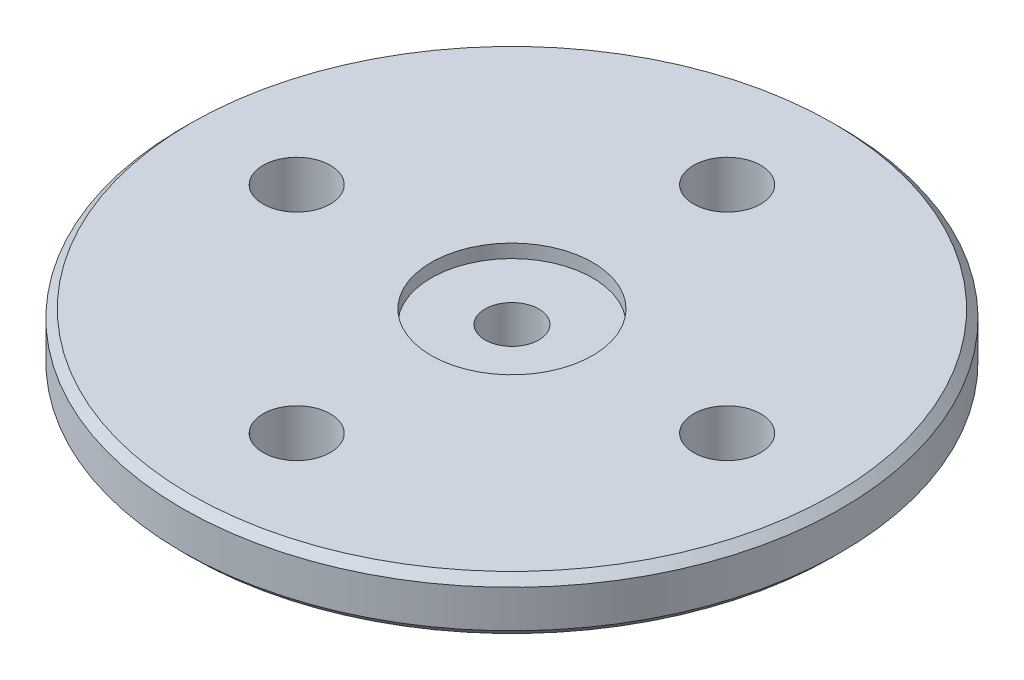
ISO-10303-21;
HEADER;
FILE_DESCRIPTION(('STEP AP214'),'2;1');
FILE_NAME('part.step','',(''),(''),'','','');
FILE_SCHEMA(('AUTOMOTIVE_DESIGN { 1 0 10303 214 1 1 1 1 }'));
ENDSEC;
DATA;
#1=APPLICATION_CONTEXT('core data for automotive mechanical design processes');
#2=APPLICATION_PROTOCOL_DEFINITION('international standard','automotive_design',2000,#1);
#3=PRODUCT_CONTEXT('',#1,'mechanical');
#4=PRODUCT('Part','Part','',(#3));
#5=PRODUCT_RELATED_PRODUCT_CATEGORY('part','',(#4));
#6=PRODUCT_DEFINITION_FORMATION('','',#4);
#7=PRODUCT_DEFINITION_CONTEXT('part definition',#1,'design');
#8=PRODUCT_DEFINITION('design','',#6,#7);
#9=PRODUCT_DEFINITION_SHAPE('','',#8);
#10=(LENGTH_UNIT() NAMED_UNIT(*) SI_UNIT(.MILLI.,.METRE.));
#11=(NAMED_UNIT(*) PLANE_ANGLE_UNIT() SI_UNIT($,.RADIAN.));
#12=(NAMED_UNIT(*) SI_UNIT($,.STERADIAN.) SOLID_ANGLE_UNIT());
#13=UNCERTAINTY_MEASURE_WITH_UNIT(LENGTH_MEASURE(1.E-05),#10,'distance_accuracy_value','');
#14=(GEOMETRIC_REPRESENTATION_CONTEXT(3) GLOBAL_UNCERTAINTY_ASSIGNED_CONTEXT((#13)) GLOBAL_UNIT_ASSIGNED_CONTEXT((#10,
#11,#12)) REPRESENTATION_CONTEXT('',''));
#15=CARTESIAN_POINT('',(0.,0.,0.));
#16=DIRECTION('',(0.,0.,1.));
#17=DIRECTION('',(1.,0.,0.));
#18=AXIS2_PLACEMENT_3D('',#15,#16,#17);
#19=CARTESIAN_POINT('',(0.,5.,0.));
#20=DIRECTION('',(0.,-1.,0.));
#21=DIRECTION('',(0.,0.,-1.));
#22=AXIS2_PLACEMENT_3D('',#19,#20,#21);
#23=CYLINDRICAL_SURFACE('',#22,1.);
#24=CARTESIAN_POINT('',(0.,4.5,0.));
#25=DIRECTION('',(0.,1.,0.));
#26=DIRECTION('',(0.,0.,1.));
#27=AXIS2_PLACEMENT_3D('',#24,#25,#26);
#28=CIRCLE('',#27,1.);
#29=CARTESIAN_POINT('',(0.,4.5,1.));
#30=VERTEX_POINT('',#29);
#31=EDGE_CURVE('E53',#30,#30,#28,.T.);
#32=ORIENTED_EDGE('',*,*,#31,.T.);
#33=EDGE_LOOP('',(#32));
#34=FACE_BOUND('',#33,.T.);
#35=CARTESIAN_POINT('',(0.,3.,0.));
#36=DIRECTION('',(0.,-1.,0.));
#37=DIRECTION('',(0.,0.,-1.));
#38=AXIS2_PLACEMENT_3D('',#35,#36,#37);
#39=CIRCLE('',#38,1.);
#40=CARTESIAN_POINT('',(0.,3.,-1.));
#41=VERTEX_POINT('',#40);
#42=EDGE_CURVE('E41',#41,#41,#39,.T.);
#43=ORIENTED_EDGE('',*,*,#42,.T.);
#44=EDGE_LOOP('',(#43));
#45=FACE_BOUND('',#44,.T.);
#46=ADVANCED_FACE('F37',(#34,#45),#23,.F.);
#47=CARTESIAN_POINT('',(0.,5.,0.));
#48=DIRECTION('',(0.,-1.,0.));
#49=DIRECTION('',(0.,0.,-1.));
#50=AXIS2_PLACEMENT_3D('',#47,#48,#49);
#51=CYLINDRICAL_SURFACE('',#50,4.);
#52=CARTESIAN_POINT('',(0.,0.300000000000002,0.));
#53=DIRECTION('',(0.,1.,0.));
#54=DIRECTION('',(0.,0.,1.));
#55=AXIS2_PLACEMENT_3D('',#52,#53,#54);
#56=CIRCLE('',#55,4.);
#57=CARTESIAN_POINT('',(0.,0.300000000000002,4.));
#58=VERTEX_POINT('',#57);
#59=EDGE_CURVE('E96',#58,#58,#56,.T.);
#60=ORIENTED_EDGE('',*,*,#59,.T.);
#61=EDGE_LOOP('',(#60));
#62=FACE_BOUND('',#61,.T.);
#63=CARTESIAN_POINT('',(0.,2.7,0.));
#64=DIRECTION('',(0.,1.,0.));
#65=DIRECTION('',(0.,0.,1.));
#66=AXIS2_PLACEMENT_3D('',#63,#64,#65);
#67=CIRCLE('',#66,4.);
#68=CARTESIAN_POINT('',(0.,2.7,4.));
#69=VERTEX_POINT('',#68);
#70=EDGE_CURVE('E91',#69,#69,#67,.F.);
#71=ORIENTED_EDGE('',*,*,#70,.T.);
#72=EDGE_LOOP('',(#71));
#73=FACE_BOUND('',#72,.T.);
#74=ADVANCED_FACE('F127',(#62,#73),#51,.T.);
#75=CARTESIAN_POINT('',(0.,5.,0.));
#76=DIRECTION('',(0.,1.,0.));
#77=DIRECTION('',(0.,0.,1.));
#78=AXIS2_PLACEMENT_3D('',#75,#76,#77);
#79=PLANE('',#78);
#80=CARTESIAN_POINT('',(0.,5.,0.));
#81=DIRECTION('',(0.,1.,0.));
#82=DIRECTION('',(0.,0.,1.));
#83=AXIS2_PLACEMENT_3D('',#80,#81,#82);
#84=CIRCLE('',#83,3.);
#85=CARTESIAN_POINT('',(0.,5.,3.));
#86=VERTEX_POINT('',#85);
#87=EDGE_CURVE('E63',#86,#86,#84,.T.);
#88=ORIENTED_EDGE('',*,*,#87,.F.);
#89=EDGE_LOOP('',(#88));
#90=FACE_BOUND('',#89,.T.);
#91=CARTESIAN_POINT('',(0.,5.,0.));
#92=DIRECTION('',(0.,1.,0.));
#93=DIRECTION('',(0.,0.,1.));
#94=AXIS2_PLACEMENT_3D('',#91,#92,#93);
#95=CIRCLE('',#94,11.95);
#96=CARTESIAN_POINT('',(0.,5.,11.95));
#97=VERTEX_POINT('',#96);
#98=EDGE_CURVE('E10',#97,#97,#95,.T.);
#99=ORIENTED_EDGE('',*,*,#98,.T.);
#100=EDGE_LOOP('',(#99));
#101=FACE_BOUND('',#100,.T.);
#102=CARTESIAN_POINT('',(-8.,5.,0.));
#103=DIRECTION('',(0.,1.,0.));
#104=DIRECTION('',(0.,0.,1.));
#105=AXIS2_PLACEMENT_3D('',#102,#103,#104);
#106=CIRCLE('',#105,1.25);
#107=CARTESIAN_POINT('',(-8.,5.,1.25));
#108=VERTEX_POINT('',#107);
#109=EDGE_CURVE('E55',#108,#108,#106,.T.);
#110=ORIENTED_EDGE('',*,*,#109,.F.);
#111=EDGE_LOOP('',(#110));
#112=FACE_BOUND('',#111,.T.);
#113=CARTESIAN_POINT('',(0.,5.,8.));
#114=DIRECTION('',(0.,1.,0.));
#115=DIRECTION('',(0.,0.,1.));
#116=AXIS2_PLACEMENT_3D('',#113,#114,#115);
#117=CIRCLE('',#116,1.25);
#118=CARTESIAN_POINT('',(0.,5.,9.25));
#119=VERTEX_POINT('',#118);
#120=EDGE_CURVE('E74',#119,#119,#117,.T.);
#121=ORIENTED_EDGE('',*,*,#120,.F.);
#122=EDGE_LOOP('',(#121));
#123=FACE_BOUND('',#122,.T.);
#124=CARTESIAN_POINT('',(8.,5.,0.));
#125=DIRECTION('',(0.,1.,0.));
#126=DIRECTION('',(0.,0.,1.));
#127=AXIS2_PLACEMENT_3D('',#124,#125,#126);
#128=CIRCLE('',#127,1.25);
#129=CARTESIAN_POINT('',(8.,5.,1.25));
#130=VERTEX_POINT('',#129);
#131=EDGE_CURVE('E79',#130,#130,#128,.T.);
#132=ORIENTED_EDGE('',*,*,#131,.F.);
#133=EDGE_LOOP('',(#132));
#134=FACE_BOUND('',#133,.T.);
#135=CARTESIAN_POINT('',(0.,5.,-8.));
#136=DIRECTION('',(0.,1.,0.));
#137=DIRECTION('',(0.,0.,1.));
#138=AXIS2_PLACEMENT_3D('',#135,#136,#137);
#139=CIRCLE('',#138,1.25);
#140=CARTESIAN_POINT('',(0.,5.,-6.75));
#141=VERTEX_POINT('',#140);
#142=EDGE_CURVE('E85',#141,#141,#139,.T.);
#143=ORIENTED_EDGE('',*,*,#142,.F.);
#144=EDGE_LOOP('',(#143));
#145=FACE_BOUND('',#144,.T.);
#146=ADVANCED_FACE('F134',(#90,#101,#112,#123,#134,#145),#79,.T.);
#147=CARTESIAN_POINT('',(0.,0.,0.));
#148=DIRECTION('',(0.,1.,0.));
#149=DIRECTION('',(0.,0.,1.));
#150=AXIS2_PLACEMENT_3D('',#147,#148,#149);
#151=PLANE('',#150);
#152=CARTESIAN_POINT('',(0.,0.,0.));
#153=DIRECTION('',(0.,-1.,0.));
#154=DIRECTION('',(0.,0.,-1.));
#155=AXIS2_PLACEMENT_3D('',#152,#153,#154);
#156=CIRCLE('',#155,2.9);
#157=CARTESIAN_POINT('',(0.,0.,-2.9));
#158=VERTEX_POINT('',#157);
#159=EDGE_CURVE('E70',#158,#158,#156,.T.);
#160=ORIENTED_EDGE('',*,*,#159,.F.);
#161=EDGE_LOOP('',(#160));
#162=FACE_BOUND('',#161,.T.);
#163=CARTESIAN_POINT('',(0.,0.,0.));
#164=DIRECTION('',(0.,1.,0.));
#165=DIRECTION('',(0.,0.,1.));
#166=AXIS2_PLACEMENT_3D('',#163,#164,#165);
#167=CIRCLE('',#166,3.69999999999999);
#168=CARTESIAN_POINT('',(0.,0.,3.69999999999999));
#169=VERTEX_POINT('',#168);
#170=EDGE_CURVE('E99',#169,#169,#167,.F.);
#171=ORIENTED_EDGE('',*,*,#170,.T.);
#172=EDGE_LOOP('',(#171));
#173=FACE_BOUND('',#172,.T.);
#174=ADVANCED_FACE('F142',(#162,#173),#151,.F.);
#175=CARTESIAN_POINT('',(0.,3.,0.));
#176=DIRECTION('',(0.,1.,0.));
#177=DIRECTION('',(0.,0.,1.));
#178=AXIS2_PLACEMENT_3D('',#175,#176,#177);
#179=CYLINDRICAL_SURFACE('',#178,12.25);
#180=CARTESIAN_POINT('',(0.,3.3,0.));
#181=DIRECTION('',(0.,1.,0.));
#182=DIRECTION('',(0.,0.,1.));
#183=AXIS2_PLACEMENT_3D('',#180,#181,#182);
#184=CIRCLE('',#183,12.25);
#185=CARTESIAN_POINT('',(0.,3.3,12.25));
#186=VERTEX_POINT('',#185);
#187=EDGE_CURVE('E45',#186,#186,#184,.T.);
#188=ORIENTED_EDGE('',*,*,#187,.T.);
#189=EDGE_LOOP('',(#188));
#190=FACE_BOUND('',#189,.T.);
#191=CARTESIAN_POINT('',(0.,4.7,0.));
#192=DIRECTION('',(0.,1.,0.));
#193=DIRECTION('',(0.,0.,1.));
#194=AXIS2_PLACEMENT_3D('',#191,#192,#193);
#195=CIRCLE('',#194,12.25);
#196=CARTESIAN_POINT('',(0.,4.7,12.25));
#197=VERTEX_POINT('',#196);
#198=EDGE_CURVE('E50',#197,#197,#195,.F.);
#199=ORIENTED_EDGE('',*,*,#198,.T.);
#200=EDGE_LOOP('',(#199));
#201=FACE_BOUND('',#200,.T.);
#202=ADVANCED_FACE('F110',(#190,#201),#179,.T.);
#203=CARTESIAN_POINT('',(0.,3.,0.));
#204=DIRECTION('',(0.,1.,0.));
#205=DIRECTION('',(0.,0.,1.));
#206=AXIS2_PLACEMENT_3D('',#203,#204,#205);
#207=PLANE('',#206);
#208=CARTESIAN_POINT('',(0.,3.,0.));
#209=DIRECTION('',(0.,1.,0.));
#210=DIRECTION('',(0.,0.,1.));
#211=AXIS2_PLACEMENT_3D('',#208,#209,#210);
#212=CIRCLE('',#211,4.30000000000001);
#213=CARTESIAN_POINT('',(0.,3.,4.30000000000001));
#214=VERTEX_POINT('',#213);
#215=EDGE_CURVE('E105',#214,#214,#212,.T.);
#216=ORIENTED_EDGE('',*,*,#215,.T.);
#217=EDGE_LOOP('',(#216));
#218=FACE_BOUND('',#217,.T.);
#219=CARTESIAN_POINT('',(0.,3.,0.));
#220=DIRECTION('',(0.,1.,0.));
#221=DIRECTION('',(0.,0.,1.));
#222=AXIS2_PLACEMENT_3D('',#219,#220,#221);
#223=CIRCLE('',#222,11.95);
#224=CARTESIAN_POINT('',(0.,3.,11.95));
#225=VERTEX_POINT('',#224);
#226=EDGE_CURVE('E102',#225,#225,#223,.F.);
#227=ORIENTED_EDGE('',*,*,#226,.T.);
#228=EDGE_LOOP('',(#227));
#229=FACE_BOUND('',#228,.T.);
#230=CARTESIAN_POINT('',(-8.,3.,0.));
#231=DIRECTION('',(0.,1.,0.));
#232=DIRECTION('',(0.,0.,1.));
#233=AXIS2_PLACEMENT_3D('',#230,#231,#232);
#234=CIRCLE('',#233,1.25);
#235=CARTESIAN_POINT('',(-8.,3.,1.25));
#236=VERTEX_POINT('',#235);
#237=EDGE_CURVE('E60',#236,#236,#234,.T.);
#238=ORIENTED_EDGE('',*,*,#237,.T.);
#239=EDGE_LOOP('',(#238));
#240=FACE_BOUND('',#239,.T.);
#241=CARTESIAN_POINT('',(0.,3.,8.));
#242=DIRECTION('',(0.,1.,0.));
#243=DIRECTION('',(0.,0.,1.));
#244=AXIS2_PLACEMENT_3D('',#241,#242,#243);
#245=CIRCLE('',#244,1.25);
#246=CARTESIAN_POINT('',(0.,3.,9.25));
#247=VERTEX_POINT('',#246);
#248=EDGE_CURVE('E76',#247,#247,#245,.T.);
#249=ORIENTED_EDGE('',*,*,#248,.T.);
#250=EDGE_LOOP('',(#249));
#251=FACE_BOUND('',#250,.T.);
#252=CARTESIAN_POINT('',(8.,3.,0.));
#253=DIRECTION('',(0.,1.,0.));
#254=DIRECTION('',(0.,0.,1.));
#255=AXIS2_PLACEMENT_3D('',#252,#253,#254);
#256=CIRCLE('',#255,1.25);
#257=CARTESIAN_POINT('',(8.,3.,1.25));
#258=VERTEX_POINT('',#257);
#259=EDGE_CURVE('E82',#258,#258,#256,.T.);
#260=ORIENTED_EDGE('',*,*,#259,.T.);
#261=EDGE_LOOP('',(#260));
#262=FACE_BOUND('',#261,.T.);
#263=CARTESIAN_POINT('',(0.,3.,-8.));
#264=DIRECTION('',(0.,1.,0.));
#265=DIRECTION('',(0.,0.,1.));
#266=AXIS2_PLACEMENT_3D('',#263,#264,#265);
#267=CIRCLE('',#266,1.25);
#268=CARTESIAN_POINT('',(0.,3.,-6.75));
#269=VERTEX_POINT('',#268);
#270=EDGE_CURVE('E88',#269,#269,#267,.T.);
#271=ORIENTED_EDGE('',*,*,#270,.T.);
#272=EDGE_LOOP('',(#271));
#273=FACE_BOUND('',#272,.T.);
#274=ADVANCED_FACE('F159',(#218,#229,#240,#251,#262,#273),#207,.F.);
#275=CARTESIAN_POINT('',(0.,3.,-8.));
#276=DIRECTION('',(0.,1.,0.));
#277=DIRECTION('',(0.,0.,1.));
#278=AXIS2_PLACEMENT_3D('',#275,#276,#277);
#279=CYLINDRICAL_SURFACE('',#278,1.25);
#280=ORIENTED_EDGE('',*,*,#270,.F.);
#281=EDGE_LOOP('',(#280));
#282=FACE_BOUND('',#281,.T.);
#283=ORIENTED_EDGE('',*,*,#142,.T.);
#284=EDGE_LOOP('',(#283));
#285=FACE_BOUND('',#284,.T.);
#286=ADVANCED_FACE('F162',(#282,#285),#279,.F.);
#287=CARTESIAN_POINT('',(8.,3.,0.));
#288=DIRECTION('',(0.,1.,0.));
#289=DIRECTION('',(0.,0.,1.));
#290=AXIS2_PLACEMENT_3D('',#287,#288,#289);
#291=CYLINDRICAL_SURFACE('',#290,1.25);
#292=ORIENTED_EDGE('',*,*,#259,.F.);
#293=EDGE_LOOP('',(#292));
#294=FACE_BOUND('',#293,.T.);
#295=ORIENTED_EDGE('',*,*,#131,.T.);
#296=EDGE_LOOP('',(#295));
#297=FACE_BOUND('',#296,.T.);
#298=ADVANCED_FACE('F175',(#294,#297),#291,.F.);
#299=CARTESIAN_POINT('',(0.,3.,8.));
#300=DIRECTION('',(0.,1.,0.));
#301=DIRECTION('',(0.,0.,1.));
#302=AXIS2_PLACEMENT_3D('',#299,#300,#301);
#303=CYLINDRICAL_SURFACE('',#302,1.25);
#304=ORIENTED_EDGE('',*,*,#248,.F.);
#305=EDGE_LOOP('',(#304));
#306=FACE_BOUND('',#305,.T.);
#307=ORIENTED_EDGE('',*,*,#120,.T.);
#308=EDGE_LOOP('',(#307));
#309=FACE_BOUND('',#308,.T.);
#310=ADVANCED_FACE('F182',(#306,#309),#303,.F.);
#311=CARTESIAN_POINT('',(-8.,3.,0.));
#312=DIRECTION('',(0.,1.,0.));
#313=DIRECTION('',(0.,0.,1.));
#314=AXIS2_PLACEMENT_3D('',#311,#312,#313);
#315=CYLINDRICAL_SURFACE('',#314,1.25);
#316=ORIENTED_EDGE('',*,*,#237,.F.);
#317=EDGE_LOOP('',(#316));
#318=FACE_BOUND('',#317,.T.);
#319=ORIENTED_EDGE('',*,*,#109,.T.);
#320=EDGE_LOOP('',(#319));
#321=FACE_BOUND('',#320,.T.);
#322=ADVANCED_FACE('F149',(#318,#321),#315,.F.);
#323=CARTESIAN_POINT('',(0.,0.300000000000002,0.));
#324=DIRECTION('',(0.,1.,0.));
#325=DIRECTION('',(0.,0.,1.));
#326=AXIS2_PLACEMENT_3D('',#323,#324,#325);
#327=CONICAL_SURFACE('',#326,4.,0.785398163397454);
#328=ORIENTED_EDGE('',*,*,#170,.F.);
#329=EDGE_LOOP('',(#328));
#330=FACE_BOUND('',#329,.T.);
#331=ORIENTED_EDGE('',*,*,#59,.F.);
#332=EDGE_LOOP('',(#331));
#333=FACE_BOUND('',#332,.T.);
#334=ADVANCED_FACE('F146',(#330,#333),#327,.T.);
#335=CARTESIAN_POINT('',(0.,3.,0.));
#336=DIRECTION('',(0.,1.,0.));
#337=DIRECTION('',(0.,0.,1.));
#338=AXIS2_PLACEMENT_3D('',#335,#336,#337);
#339=CONICAL_SURFACE('',#338,4.30000000000001,0.785398163397451);
#340=ORIENTED_EDGE('',*,*,#70,.F.);
#341=EDGE_LOOP('',(#340));
#342=FACE_BOUND('',#341,.T.);
#343=ORIENTED_EDGE('',*,*,#215,.F.);
#344=EDGE_LOOP('',(#343));
#345=FACE_BOUND('',#344,.T.);
#346=ADVANCED_FACE('F124',(#342,#345),#339,.T.);
#347=CARTESIAN_POINT('',(0.,3.3,0.));
#348=DIRECTION('',(0.,1.,0.));
#349=DIRECTION('',(0.,0.,1.));
#350=AXIS2_PLACEMENT_3D('',#347,#348,#349);
#351=CONICAL_SURFACE('',#350,12.25,0.785398163397448);
#352=ORIENTED_EDGE('',*,*,#226,.F.);
#353=EDGE_LOOP('',(#352));
#354=FACE_BOUND('',#353,.T.);
#355=ORIENTED_EDGE('',*,*,#187,.F.);
#356=EDGE_LOOP('',(#355));
#357=FACE_BOUND('',#356,.T.);
#358=ADVANCED_FACE('F115',(#354,#357),#351,.T.);
#359=CARTESIAN_POINT('',(0.,5.,0.));
#360=DIRECTION('',(0.,-1.,0.));
#361=DIRECTION('',(0.,0.,-1.));
#362=AXIS2_PLACEMENT_3D('',#359,#360,#361);
#363=CONICAL_SURFACE('',#362,11.95,0.78539816339744);
#364=ORIENTED_EDGE('',*,*,#198,.F.);
#365=EDGE_LOOP('',(#364));
#366=FACE_BOUND('',#365,.T.);
#367=ORIENTED_EDGE('',*,*,#98,.F.);
#368=EDGE_LOOP('',(#367));
#369=FACE_BOUND('',#368,.T.);
#370=ADVANCED_FACE('F39',(#366,#369),#363,.T.);
#371=CARTESIAN_POINT('',(0.,4.5,0.));
#372=DIRECTION('',(0.,1.,0.));
#373=DIRECTION('',(0.,0.,1.));
#374=AXIS2_PLACEMENT_3D('',#371,#372,#373);
#375=CYLINDRICAL_SURFACE('',#374,3.);
#376=CARTESIAN_POINT('',(0.,4.5,0.));
#377=DIRECTION('',(0.,1.,0.));
#378=DIRECTION('',(0.,0.,1.));
#379=AXIS2_PLACEMENT_3D('',#376,#377,#378);
#380=CIRCLE('',#379,3.);
#381=CARTESIAN_POINT('',(0.,4.5,3.));
#382=VERTEX_POINT('',#381);
#383=EDGE_CURVE('E56',#382,#382,#380,.T.);
#384=ORIENTED_EDGE('',*,*,#383,.F.);
#385=EDGE_LOOP('',(#384));
#386=FACE_BOUND('',#385,.T.);
#387=ORIENTED_EDGE('',*,*,#87,.T.);
#388=EDGE_LOOP('',(#387));
#389=FACE_BOUND('',#388,.T.);
#390=ADVANCED_FACE('F114',(#386,#389),#375,.F.);
#391=CARTESIAN_POINT('',(0.,4.5,0.));
#392=DIRECTION('',(0.,1.,0.));
#393=DIRECTION('',(0.,0.,1.));
#394=AXIS2_PLACEMENT_3D('',#391,#392,#393);
#395=PLANE('',#394);
#396=ORIENTED_EDGE('',*,*,#31,.F.);
#397=EDGE_LOOP('',(#396));
#398=FACE_BOUND('',#397,.T.);
#399=ORIENTED_EDGE('',*,*,#383,.T.);
#400=EDGE_LOOP('',(#399));
#401=FACE_BOUND('',#400,.T.);
#402=ADVANCED_FACE('F121',(#398,#401),#395,.T.);
#403=CARTESIAN_POINT('',(0.,3.,0.));
#404=DIRECTION('',(0.,-1.,0.));
#405=DIRECTION('',(0.,0.,-1.));
#406=AXIS2_PLACEMENT_3D('',#403,#404,#405);
#407=CYLINDRICAL_SURFACE('',#406,2.9);
#408=CARTESIAN_POINT('',(0.,3.,0.));
#409=DIRECTION('',(0.,-1.,0.));
#410=DIRECTION('',(0.,0.,-1.));
#411=AXIS2_PLACEMENT_3D('',#408,#409,#410);
#412=CIRCLE('',#411,2.9);
#413=CARTESIAN_POINT('',(0.,3.,-2.9));
#414=VERTEX_POINT('',#413);
#415=EDGE_CURVE('E208',#414,#414,#412,.T.);
#416=ORIENTED_EDGE('',*,*,#415,.F.);
#417=EDGE_LOOP('',(#416));
#418=FACE_BOUND('',#417,.T.);
#419=ORIENTED_EDGE('',*,*,#159,.T.);
#420=EDGE_LOOP('',(#419));
#421=FACE_BOUND('',#420,.T.);
#422=ADVANCED_FACE('F193',(#418,#421),#407,.F.);
#423=CARTESIAN_POINT('',(0.,3.,0.));
#424=DIRECTION('',(0.,-1.,0.));
#425=DIRECTION('',(0.,0.,-1.));
#426=AXIS2_PLACEMENT_3D('',#423,#424,#425);
#427=PLANE('',#426);
#428=ORIENTED_EDGE('',*,*,#42,.F.);
#429=EDGE_LOOP('',(#428));
#430=FACE_BOUND('',#429,.T.);
#431=ORIENTED_EDGE('',*,*,#415,.T.);
#432=EDGE_LOOP('',(#431));
#433=FACE_BOUND('',#432,.T.);
#434=ADVANCED_FACE('F197',(#430,#433),#427,.T.);
#435=CLOSED_SHELL('',(#46,#74,#146,#174,#202,#274,#286,#298,#310,#322,#334,#346,#358,#370,#390,
#402,#422,#434));
#436=MANIFOLD_SOLID_BREP('B2',#435);
#437=ADVANCED_BREP_SHAPE_REPRESENTATION('',(#18,#436),#14);
#438=SHAPE_DEFINITION_REPRESENTATION(#9,#437);
ENDSEC;
END-ISO-10303-21;
